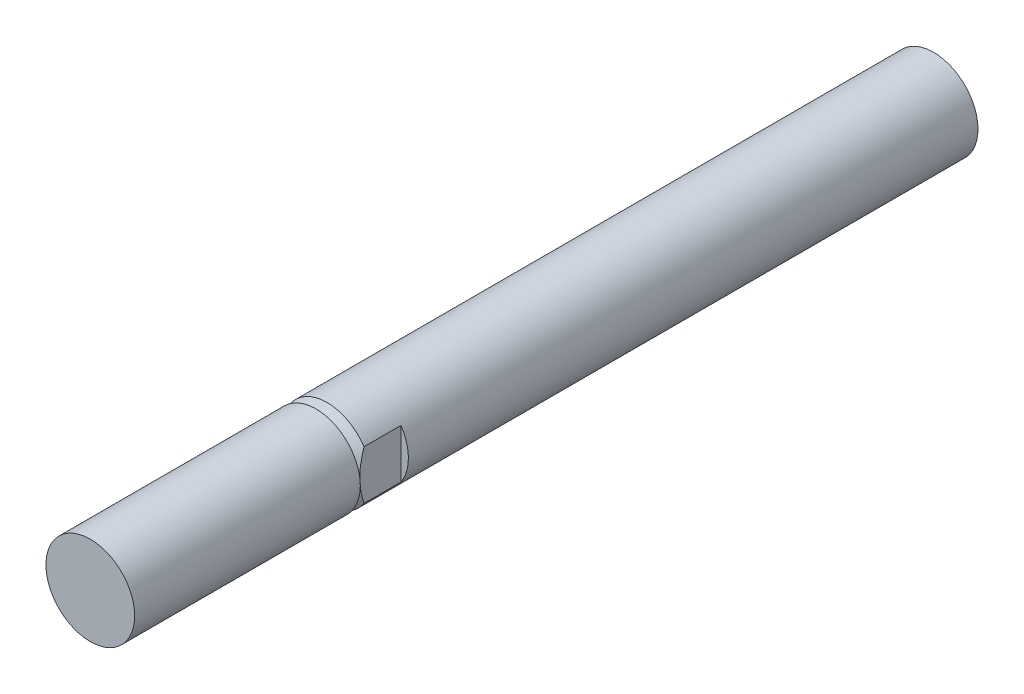
ISO-10303-21;
HEADER;
FILE_DESCRIPTION(('STEP AP214'),'2;1');
FILE_NAME('part.step','',(''),(''),'','','');
FILE_SCHEMA(('AUTOMOTIVE_DESIGN { 1 0 10303 214 1 1 1 1 }'));
ENDSEC;
DATA;
#1=APPLICATION_CONTEXT('core data for automotive mechanical design processes');
#2=APPLICATION_PROTOCOL_DEFINITION('international standard','automotive_design',2000,#1);
#3=PRODUCT_CONTEXT('',#1,'mechanical');
#4=PRODUCT('Part','Part','',(#3));
#5=PRODUCT_RELATED_PRODUCT_CATEGORY('part','',(#4));
#6=PRODUCT_DEFINITION_FORMATION('','',#4);
#7=PRODUCT_DEFINITION_CONTEXT('part definition',#1,'design');
#8=PRODUCT_DEFINITION('design','',#6,#7);
#9=PRODUCT_DEFINITION_SHAPE('','',#8);
#10=(LENGTH_UNIT() NAMED_UNIT(*) SI_UNIT(.MILLI.,.METRE.));
#11=(NAMED_UNIT(*) PLANE_ANGLE_UNIT() SI_UNIT($,.RADIAN.));
#12=(NAMED_UNIT(*) SI_UNIT($,.STERADIAN.) SOLID_ANGLE_UNIT());
#13=UNCERTAINTY_MEASURE_WITH_UNIT(LENGTH_MEASURE(1.E-05),#10,'distance_accuracy_value','');
#14=(GEOMETRIC_REPRESENTATION_CONTEXT(3) GLOBAL_UNCERTAINTY_ASSIGNED_CONTEXT((#13)) GLOBAL_UNIT_ASSIGNED_CONTEXT((#10,
#11,#12)) REPRESENTATION_CONTEXT('',''));
#15=CARTESIAN_POINT('',(0.,0.,0.));
#16=DIRECTION('',(0.,0.,1.));
#17=DIRECTION('',(1.,0.,0.));
#18=AXIS2_PLACEMENT_3D('',#15,#16,#17);
#19=CARTESIAN_POINT('',(0.,0.,-65.4852813742386));
#20=DIRECTION('',(0.,0.,1.));
#21=DIRECTION('',(1.,0.,0.));
#22=AXIS2_PLACEMENT_3D('',#19,#20,#21);
#23=CYLINDRICAL_SURFACE('',#22,3.);
#24=CARTESIAN_POINT('',(0.,0.,0.));
#25=DIRECTION('',(0.,0.,1.));
#26=DIRECTION('',(1.,0.,0.));
#27=AXIS2_PLACEMENT_3D('',#24,#25,#26);
#28=CIRCLE('',#27,3.);
#29=CARTESIAN_POINT('',(3.,0.,0.));
#30=VERTEX_POINT('',#29);
#31=EDGE_CURVE('E95',#30,#30,#28,.T.);
#32=ORIENTED_EDGE('',*,*,#31,.F.);
#33=EDGE_LOOP('',(#32));
#34=FACE_BOUND('',#33,.T.);
#35=CARTESIAN_POINT('',(0.,0.,-15.25));
#36=DIRECTION('',(0.,0.,1.));
#37=DIRECTION('',(1.,0.,0.));
#38=AXIS2_PLACEMENT_3D('',#35,#36,#37);
#39=CIRCLE('',#38,3.);
#40=CARTESIAN_POINT('',(3.,0.,-15.25));
#41=VERTEX_POINT('',#40);
#42=EDGE_CURVE('E98',#41,#41,#39,.T.);
#43=ORIENTED_EDGE('',*,*,#42,.T.);
#44=EDGE_LOOP('',(#43));
#45=FACE_BOUND('',#44,.T.);
#46=ADVANCED_FACE('F32',(#34,#45),#23,.T.);
#47=CARTESIAN_POINT('',(0.,0.,0.));
#48=DIRECTION('',(0.,0.,1.));
#49=DIRECTION('',(1.,0.,0.));
#50=AXIS2_PLACEMENT_3D('',#47,#48,#49);
#51=PLANE('',#50);
#52=ORIENTED_EDGE('',*,*,#31,.T.);
#53=EDGE_LOOP('',(#52));
#54=FACE_BOUND('',#53,.T.);
#55=ADVANCED_FACE('F143',(#54),#51,.T.);
#56=CARTESIAN_POINT('',(0.,0.,-15.25));
#57=DIRECTION('',(0.,0.,1.));
#58=DIRECTION('',(1.,0.,0.));
#59=AXIS2_PLACEMENT_3D('',#56,#57,#58);
#60=CONICAL_SURFACE('',#59,3.,1.0471975511966);
#61=CARTESIAN_POINT('',(0.,0.,-15.625));
#62=DIRECTION('',(0.,0.,1.));
#63=DIRECTION('',(1.,0.,0.));
#64=AXIS2_PLACEMENT_3D('',#61,#62,#63);
#65=CIRCLE('',#64,2.35048094716167);
#66=CARTESIAN_POINT('',(2.35048094716167,0.,-15.625));
#67=VERTEX_POINT('',#66);
#68=EDGE_CURVE('E104',#67,#67,#65,.T.);
#69=ORIENTED_EDGE('',*,*,#68,.T.);
#70=EDGE_LOOP('',(#69));
#71=FACE_BOUND('',#70,.T.);
#72=ORIENTED_EDGE('',*,*,#42,.F.);
#73=EDGE_LOOP('',(#72));
#74=FACE_BOUND('',#73,.T.);
#75=ADVANCED_FACE('F126',(#71,#74),#60,.T.);
#76=CARTESIAN_POINT('',(0.,0.,-15.625));
#77=DIRECTION('',(0.,0.,-1.));
#78=DIRECTION('',(-1.,0.,0.));
#79=AXIS2_PLACEMENT_3D('',#76,#77,#78);
#80=CONICAL_SURFACE('',#79,2.35048094716167,1.0471975511966);
#81=CARTESIAN_POINT('',(-2.5,-4.81793860033048,-17.4017717973103));
#82=CARTESIAN_POINT('',(-2.5,-4.69838379168555,-17.3405141325334));
#83=CARTESIAN_POINT('',(-2.5,-4.57863903285995,-17.2796233257586));
#84=CARTESIAN_POINT('',(-2.5,-4.33867077736017,-17.1587721081766));
#85=CARTESIAN_POINT('',(-2.5,-4.21844724785575,-17.0988117626031));
#86=CARTESIAN_POINT('',(-2.5,-3.97713061718876,-16.9798746260798));
#87=CARTESIAN_POINT('',(-2.5,-3.85603607746253,-16.9209007478018));
#88=CARTESIAN_POINT('',(-2.5,-3.61316609263024,-16.8043772100494));
#89=CARTESIAN_POINT('',(-2.5,-3.49139066457805,-16.7468275150983));
#90=CARTESIAN_POINT('',(-2.5,-3.2404121498268,-16.6304602379033));
#91=CARTESIAN_POINT('',(-2.5,-3.1111629059294,-16.5717418656522));
#92=CARTESIAN_POINT('',(-2.5,-2.85152693652563,-16.456879159109));
#93=CARTESIAN_POINT('',(-2.5,-2.72114025834698,-16.4007347183201));
#94=CARTESIAN_POINT('',(-2.5,-2.45907235317036,-16.2918692011967));
#95=CARTESIAN_POINT('',(-2.5,-2.32739237853672,-16.2391451292102));
#96=CARTESIAN_POINT('',(-2.5,-2.06233467793914,-16.1381810991474));
#97=CARTESIAN_POINT('',(-2.5,-1.92895725263663,-16.0899403591894));
#98=CARTESIAN_POINT('',(-2.5,-1.66159629743113,-15.9999263914234));
#99=CARTESIAN_POINT('',(-2.5,-1.5276344347262,-15.9580896234961));
#100=CARTESIAN_POINT('',(-2.5,-1.25748328973638,-15.8821937639213));
#101=CARTESIAN_POINT('',(-2.5,-1.12129403064475,-15.8481345913429));
#102=CARTESIAN_POINT('',(-2.5,-0.849309674673648,-15.7906265740925));
#103=CARTESIAN_POINT('',(-2.5,-0.713554976247273,-15.7669909381224));
#104=CARTESIAN_POINT('',(-2.5,-0.440472397486285,-15.7315514878634));
#105=CARTESIAN_POINT('',(-2.5,-0.30314488357933,-15.7197449721949));
#106=CARTESIAN_POINT('',(-2.5,-0.0841222520504025,-15.711373879411));
#107=CARTESIAN_POINT('',(-2.5,-0.00257239136520686,-15.7105576243309));
#108=CARTESIAN_POINT('',(-2.5,0.160450666129283,-15.7135308252926));
#109=CARTESIAN_POINT('',(-2.5,0.241923859889431,-15.7173204573621));
#110=CARTESIAN_POINT('',(-2.5,0.404551415813537,-15.7293584801001));
#111=CARTESIAN_POINT('',(-2.5,0.485705709759785,-15.7376077774814));
#112=CARTESIAN_POINT('',(-2.5,0.647486827845084,-15.7582526187821));
#113=CARTESIAN_POINT('',(-2.5,0.728113603611079,-15.7706485376578));
#114=CARTESIAN_POINT('',(-2.5,0.890812172595438,-15.7995491324688));
#115=CARTESIAN_POINT('',(-2.5,0.97286610918155,-15.8161534080264));
#116=CARTESIAN_POINT('',(-2.5,1.13619666010214,-15.8528023635103));
#117=CARTESIAN_POINT('',(-2.5,1.21747325822192,-15.8728471150377));
#118=CARTESIAN_POINT('',(-2.5,1.37925919436247,-15.9158971739533));
#119=CARTESIAN_POINT('',(-2.5,1.45976829527697,-15.9389033663069));
#120=CARTESIAN_POINT('',(-2.5,1.620015699497,-15.9874261343163));
#121=CARTESIAN_POINT('',(-2.5,1.69975404831211,-16.0129425607468));
#122=CARTESIAN_POINT('',(-2.5,1.93372402907988,-16.0912588997182));
#123=CARTESIAN_POINT('',(-2.5,2.08696868176532,-16.1470068492297));
#124=CARTESIAN_POINT('',(-2.5,2.39126756520607,-16.2642237748622));
#125=CARTESIAN_POINT('',(-2.5,2.54232112508943,-16.3256944621578));
#126=CARTESIAN_POINT('',(-2.5,2.84281888331128,-16.452834117824));
#127=CARTESIAN_POINT('',(-2.5,2.99226132411979,-16.5185072168529));
#128=CARTESIAN_POINT('',(-2.5,3.28974519522344,-16.6528920724727));
#129=CARTESIAN_POINT('',(-2.5,3.4377867811834,-16.7216034865118));
#130=CARTESIAN_POINT('',(-2.5,3.73330639647042,-16.8615574332983));
#131=CARTESIAN_POINT('',(-2.5,3.88078058075447,-16.9328080586117));
#132=CARTESIAN_POINT('',(-2.5,4.1748654950973,-17.0770722316009));
#133=CARTESIAN_POINT('',(-2.5,4.32147620702218,-17.1500858161378));
#134=CARTESIAN_POINT('',(-2.5,4.76011529781237,-17.3710736157298));
#135=CARTESIAN_POINT('',(-2.5,5.05112053313033,-17.5210765649037));
#136=CARTESIAN_POINT('',(-2.5,5.5923599264763,-17.8041112421102));
#137=CARTESIAN_POINT('',(-2.5,5.84281913396191,-17.9367155602142));
#138=CARTESIAN_POINT('',(-2.5,6.34280158348747,-18.2037724972034));
#139=CARTESIAN_POINT('',(-2.5,6.59232466873618,-18.3382254095326));
#140=CARTESIAN_POINT('',(-2.5,7.08889747255229,-18.6075052987425));
#141=CARTESIAN_POINT('',(-2.5,7.3359522396257,-18.7423229845447));
#142=CARTESIAN_POINT('',(-2.5,7.82946604805437,-19.0129374854761));
#143=CARTESIAN_POINT('',(-2.5,8.07592519070801,-19.1487341157809));
#144=CARTESIAN_POINT('',(-2.5,8.32218900881266,-19.2848815186773));
#145=B_SPLINE_CURVE_WITH_KNOTS('',3,(#81,#82,#83,#84,#85,#86,#87,#88,#89,#90,#91,#92,#93,#94,
#95,#96,#97,#98,#99,#100,#101,#102,#103,#104,#105,#106,#107,#108,#109,#110,#111,#112,#113,#114,
#115,#116,#117,#118,#119,#120,#121,#122,#123,#124,#125,#126,#127,#128,#129,#130,#131,#132,#133,
#134,#135,#136,#137,#138,#139,#140,#141,#142,#143,#144),.UNSPECIFIED.,.F.,.F.,(4,2,2,2,2,2,2,2,
2,2,2,2,2,2,2,2,2,2,2,2,2,2,2,2,2,2,2,2,2,2,2,4),(0.,0.40300656306994,0.806041254020603,
1.21010828081371,1.61416523208556,2.04002990268203,2.46587693711974,2.8913458223634,
3.31674036711918,3.73759408086623,4.1584434151648,4.57140986932208,4.98428199409834,
5.22882539854366,5.47337814922667,5.7179806396394,5.96260525410868,6.21367152510888,
6.46474302179146,6.71588972095366,6.96702149927908,7.45604740402945,7.94522000655761,
8.43488104325745,8.92448701367628,9.41582462568016,9.90717251978972,10.8893028547359,
11.7394860044739,12.5898057063759,13.4341414222954,14.2783216982539),.UNSPECIFIED.);
#146=CARTESIAN_POINT('',(-2.5,-1.6583123951777,-16.));
#147=VERTEX_POINT('',#146);
#148=CARTESIAN_POINT('',(-2.5,1.6583123951777,-16.));
#149=VERTEX_POINT('',#148);
#150=EDGE_CURVE('E71',#147,#149,#145,.T.);
#151=ORIENTED_EDGE('',*,*,#150,.F.);
#152=CARTESIAN_POINT('',(0.,0.,-16.));
#153=DIRECTION('',(0.,0.,1.));
#154=DIRECTION('',(1.,0.,0.));
#155=AXIS2_PLACEMENT_3D('',#152,#153,#154);
#156=CIRCLE('',#155,3.);
#157=CARTESIAN_POINT('',(2.5,-1.6583123951777,-16.));
#158=VERTEX_POINT('',#157);
#159=EDGE_CURVE('E103',#147,#158,#156,.T.);
#160=ORIENTED_EDGE('',*,*,#159,.T.);
#161=CARTESIAN_POINT('',(2.5,-4.81793860033048,-17.4017717973103));
#162=CARTESIAN_POINT('',(2.5,-4.69838379168555,-17.3405141325334));
#163=CARTESIAN_POINT('',(2.5,-4.57863903285995,-17.2796233257586));
#164=CARTESIAN_POINT('',(2.5,-4.33867077736017,-17.1587721081766));
#165=CARTESIAN_POINT('',(2.5,-4.21844724785575,-17.0988117626031));
#166=CARTESIAN_POINT('',(2.5,-3.97713061718876,-16.9798746260798));
#167=CARTESIAN_POINT('',(2.5,-3.85603607746253,-16.9209007478018));
#168=CARTESIAN_POINT('',(2.5,-3.61316609263024,-16.8043772100494));
#169=CARTESIAN_POINT('',(2.5,-3.49139066457805,-16.7468275150983));
#170=CARTESIAN_POINT('',(2.5,-3.2404121498268,-16.6304602379033));
#171=CARTESIAN_POINT('',(2.5,-3.1111629059294,-16.5717418656522));
#172=CARTESIAN_POINT('',(2.5,-2.85152693652563,-16.456879159109));
#173=CARTESIAN_POINT('',(2.5,-2.72114025834698,-16.4007347183201));
#174=CARTESIAN_POINT('',(2.5,-2.45907235317036,-16.2918692011967));
#175=CARTESIAN_POINT('',(2.5,-2.32739237853672,-16.2391451292102));
#176=CARTESIAN_POINT('',(2.5,-2.06233467793914,-16.1381810991474));
#177=CARTESIAN_POINT('',(2.5,-1.92895725263663,-16.0899403591894));
#178=CARTESIAN_POINT('',(2.5,-1.66159629743113,-15.9999263914234));
#179=CARTESIAN_POINT('',(2.5,-1.5276344347262,-15.9580896234961));
#180=CARTESIAN_POINT('',(2.5,-1.25748328973638,-15.8821937639213));
#181=CARTESIAN_POINT('',(2.5,-1.12129403064475,-15.8481345913429));
#182=CARTESIAN_POINT('',(2.5,-0.849309674673648,-15.7906265740925));
#183=CARTESIAN_POINT('',(2.5,-0.713554976247273,-15.7669909381224));
#184=CARTESIAN_POINT('',(2.5,-0.440472397486285,-15.7315514878634));
#185=CARTESIAN_POINT('',(2.5,-0.30314488357933,-15.7197449721949));
#186=CARTESIAN_POINT('',(2.5,-0.0841222520504025,-15.711373879411));
#187=CARTESIAN_POINT('',(2.5,-0.00257239136520686,-15.7105576243309));
#188=CARTESIAN_POINT('',(2.5,0.160450666129283,-15.7135308252926));
#189=CARTESIAN_POINT('',(2.5,0.241923859889431,-15.7173204573621));
#190=CARTESIAN_POINT('',(2.5,0.404551415813537,-15.7293584801001));
#191=CARTESIAN_POINT('',(2.5,0.485705709759785,-15.7376077774814));
#192=CARTESIAN_POINT('',(2.5,0.647486827845084,-15.7582526187821));
#193=CARTESIAN_POINT('',(2.5,0.728113603611079,-15.7706485376578));
#194=CARTESIAN_POINT('',(2.5,0.890812172595438,-15.7995491324688));
#195=CARTESIAN_POINT('',(2.5,0.97286610918155,-15.8161534080264));
#196=CARTESIAN_POINT('',(2.5,1.13619666010214,-15.8528023635103));
#197=CARTESIAN_POINT('',(2.5,1.21747325822192,-15.8728471150377));
#198=CARTESIAN_POINT('',(2.5,1.37925919436247,-15.9158971739533));
#199=CARTESIAN_POINT('',(2.5,1.45976829527697,-15.9389033663069));
#200=CARTESIAN_POINT('',(2.5,1.620015699497,-15.9874261343163));
#201=CARTESIAN_POINT('',(2.5,1.69975404831211,-16.0129425607468));
#202=CARTESIAN_POINT('',(2.5,1.93372402907988,-16.0912588997182));
#203=CARTESIAN_POINT('',(2.5,2.08696868176532,-16.1470068492297));
#204=CARTESIAN_POINT('',(2.5,2.39126756520607,-16.2642237748622));
#205=CARTESIAN_POINT('',(2.5,2.54232112508943,-16.3256944621578));
#206=CARTESIAN_POINT('',(2.5,2.84281888331128,-16.452834117824));
#207=CARTESIAN_POINT('',(2.5,2.99226132411979,-16.5185072168529));
#208=CARTESIAN_POINT('',(2.5,3.28974519522344,-16.6528920724727));
#209=CARTESIAN_POINT('',(2.5,3.4377867811834,-16.7216034865118));
#210=CARTESIAN_POINT('',(2.5,3.73330639647042,-16.8615574332983));
#211=CARTESIAN_POINT('',(2.5,3.88078058075447,-16.9328080586117));
#212=CARTESIAN_POINT('',(2.5,4.1748654950973,-17.0770722316009));
#213=CARTESIAN_POINT('',(2.5,4.32147620702218,-17.1500858161378));
#214=CARTESIAN_POINT('',(2.5,4.76011529781237,-17.3710736157298));
#215=CARTESIAN_POINT('',(2.5,5.05112053313033,-17.5210765649037));
#216=CARTESIAN_POINT('',(2.5,5.5923599264763,-17.8041112421102));
#217=CARTESIAN_POINT('',(2.5,5.84281913396191,-17.9367155602142));
#218=CARTESIAN_POINT('',(2.5,6.34280158348747,-18.2037724972034));
#219=CARTESIAN_POINT('',(2.5,6.59232466873618,-18.3382254095326));
#220=CARTESIAN_POINT('',(2.5,7.08889747255229,-18.6075052987425));
#221=CARTESIAN_POINT('',(2.5,7.3359522396257,-18.7423229845447));
#222=CARTESIAN_POINT('',(2.5,7.82946604805437,-19.0129374854761));
#223=CARTESIAN_POINT('',(2.5,8.07592519070801,-19.1487341157809));
#224=CARTESIAN_POINT('',(2.5,8.32218900881266,-19.2848815186773));
#225=B_SPLINE_CURVE_WITH_KNOTS('',3,(#161,#162,#163,#164,#165,#166,#167,#168,#169,#170,#171,
#172,#173,#174,#175,#176,#177,#178,#179,#180,#181,#182,#183,#184,#185,#186,#187,#188,#189,#190,
#191,#192,#193,#194,#195,#196,#197,#198,#199,#200,#201,#202,#203,#204,#205,#206,#207,#208,#209,
#210,#211,#212,#213,#214,#215,#216,#217,#218,#219,#220,#221,#222,#223,#224),.UNSPECIFIED.,.F.,
.F.,(4,2,2,2,2,2,2,2,2,2,2,2,2,2,2,2,2,2,2,2,2,2,2,2,2,2,2,2,2,2,2,4),(0.,0.40300656306994,
0.806041254020603,1.21010828081371,1.61416523208556,2.04002990268203,2.46587693711974,
2.8913458223634,3.31674036711918,3.73759408086623,4.1584434151648,4.57140986932208,
4.98428199409834,5.22882539854366,5.47337814922667,5.7179806396394,5.96260525410868,
6.21367152510888,6.46474302179146,6.71588972095366,6.96702149927908,7.45604740402945,
7.94522000655761,8.43488104325745,8.92448701367628,9.41582462568016,9.90717251978972,
10.8893028547359,11.7394860044739,12.5898057063759,13.4341414222954,14.2783216982539),.UNSPECIFIED.);
#226=CARTESIAN_POINT('',(2.5,1.6583123951777,-16.));
#227=VERTEX_POINT('',#226);
#228=EDGE_CURVE('E107',#227,#158,#225,.F.);
#229=ORIENTED_EDGE('',*,*,#228,.F.);
#230=EDGE_CURVE('E101',#227,#149,#156,.T.);
#231=ORIENTED_EDGE('',*,*,#230,.T.);
#232=EDGE_LOOP('',(#151,#160,#229,#231));
#233=FACE_BOUND('',#232,.T.);
#234=ORIENTED_EDGE('',*,*,#68,.F.);
#235=EDGE_LOOP('',(#234));
#236=FACE_BOUND('',#235,.T.);
#237=ADVANCED_FACE('F121',(#233,#236),#80,.T.);
#238=CARTESIAN_POINT('',(0.,0.,-57.));
#239=DIRECTION('',(0.,0.,1.));
#240=DIRECTION('',(1.,0.,0.));
#241=AXIS2_PLACEMENT_3D('',#238,#239,#240);
#242=PLANE('',#241);
#243=CARTESIAN_POINT('',(0.,0.,-57.));
#244=DIRECTION('',(0.,0.,1.));
#245=DIRECTION('',(1.,0.,0.));
#246=AXIS2_PLACEMENT_3D('',#243,#244,#245);
#247=CIRCLE('',#246,3.);
#248=CARTESIAN_POINT('',(3.,0.,-57.));
#249=VERTEX_POINT('',#248);
#250=EDGE_CURVE('E92',#249,#249,#247,.F.);
#251=ORIENTED_EDGE('',*,*,#250,.T.);
#252=EDGE_LOOP('',(#251));
#253=FACE_BOUND('',#252,.T.);
#254=ADVANCED_FACE('F125',(#253),#242,.F.);
#255=DIRECTION('',(0.,0.,1.));
#256=VECTOR('',#255,1.);
#257=CARTESIAN_POINT('',(-2.5,1.6583123951777,-65.4852813742386));
#258=LINE('',#257,#256);
#259=CARTESIAN_POINT('',(-2.5,1.6583123951777,-18.5));
#260=VERTEX_POINT('',#259);
#261=EDGE_CURVE('E11',#149,#260,#258,.F.);
#262=ORIENTED_EDGE('',*,*,#261,.F.);
#263=ORIENTED_EDGE('',*,*,#230,.F.);
#264=DIRECTION('',(0.,0.,1.));
#265=VECTOR('',#264,1.);
#266=CARTESIAN_POINT('',(2.5,1.6583123951777,-65.4852813742386));
#267=LINE('',#266,#265);
#268=CARTESIAN_POINT('',(2.5,1.6583123951777,-18.5));
#269=VERTEX_POINT('',#268);
#270=EDGE_CURVE('E88',#269,#227,#267,.T.);
#271=ORIENTED_EDGE('',*,*,#270,.F.);
#272=CARTESIAN_POINT('',(0.,0.,-18.5));
#273=DIRECTION('',(0.,0.,-1.));
#274=DIRECTION('',(-1.,0.,0.));
#275=AXIS2_PLACEMENT_3D('',#272,#273,#274);
#276=CIRCLE('',#275,3.);
#277=CARTESIAN_POINT('',(2.5,-1.6583123951777,-18.5));
#278=VERTEX_POINT('',#277);
#279=EDGE_CURVE('E90',#278,#269,#276,.F.);
#280=ORIENTED_EDGE('',*,*,#279,.F.);
#281=DIRECTION('',(0.,0.,1.));
#282=VECTOR('',#281,1.);
#283=CARTESIAN_POINT('',(2.5,-1.6583123951777,-65.4852813742386));
#284=LINE('',#283,#282);
#285=EDGE_CURVE('E84',#158,#278,#284,.F.);
#286=ORIENTED_EDGE('',*,*,#285,.F.);
#287=ORIENTED_EDGE('',*,*,#159,.F.);
#288=DIRECTION('',(0.,0.,1.));
#289=VECTOR('',#288,1.);
#290=CARTESIAN_POINT('',(-2.5,-1.6583123951777,-65.4852813742386));
#291=LINE('',#290,#289);
#292=CARTESIAN_POINT('',(-2.5,-1.6583123951777,-18.5));
#293=VERTEX_POINT('',#292);
#294=EDGE_CURVE('E83',#293,#147,#291,.T.);
#295=ORIENTED_EDGE('',*,*,#294,.F.);
#296=CARTESIAN_POINT('',(0.,0.,-18.5));
#297=DIRECTION('',(0.,0.,-1.));
#298=DIRECTION('',(-1.,0.,0.));
#299=AXIS2_PLACEMENT_3D('',#296,#297,#298);
#300=CIRCLE('',#299,3.);
#301=EDGE_CURVE('E39',#260,#293,#300,.F.);
#302=ORIENTED_EDGE('',*,*,#301,.F.);
#303=EDGE_LOOP('',(#262,#263,#271,#280,#286,#287,#295,#302));
#304=FACE_BOUND('',#303,.T.);
#305=ORIENTED_EDGE('',*,*,#250,.F.);
#306=EDGE_LOOP('',(#305));
#307=FACE_BOUND('',#306,.T.);
#308=ADVANCED_FACE('F80',(#304,#307),#23,.T.);
#309=CARTESIAN_POINT('',(2.5,-3.,-18.5));
#310=DIRECTION('',(-1.,0.,0.));
#311=DIRECTION('',(0.,0.,1.));
#312=AXIS2_PLACEMENT_3D('',#309,#310,#311);
#313=PLANE('',#312);
#314=ORIENTED_EDGE('',*,*,#285,.T.);
#315=DIRECTION('',(0.,1.,0.));
#316=VECTOR('',#315,1.);
#317=CARTESIAN_POINT('',(2.5,-3.,-18.5));
#318=LINE('',#317,#316);
#319=EDGE_CURVE('E52',#278,#269,#318,.T.);
#320=ORIENTED_EDGE('',*,*,#319,.T.);
#321=ORIENTED_EDGE('',*,*,#270,.T.);
#322=ORIENTED_EDGE('',*,*,#228,.T.);
#323=EDGE_LOOP('',(#314,#320,#321,#322));
#324=FACE_BOUND('',#323,.T.);
#325=ADVANCED_FACE('F117',(#324),#313,.F.);
#326=CARTESIAN_POINT('',(5.375,-3.,-18.5));
#327=DIRECTION('',(0.,0.,-1.));
#328=DIRECTION('',(-1.,0.,0.));
#329=AXIS2_PLACEMENT_3D('',#326,#327,#328);
#330=PLANE('',#329);
#331=ORIENTED_EDGE('',*,*,#279,.T.);
#332=ORIENTED_EDGE('',*,*,#319,.F.);
#333=EDGE_LOOP('',(#331,#332));
#334=FACE_BOUND('',#333,.T.);
#335=ADVANCED_FACE('F128',(#334),#330,.F.);
#336=CARTESIAN_POINT('',(-2.5,-3.,-18.5));
#337=DIRECTION('',(0.,0.,-1.));
#338=DIRECTION('',(-1.,0.,0.));
#339=AXIS2_PLACEMENT_3D('',#336,#337,#338);
#340=PLANE('',#339);
#341=ORIENTED_EDGE('',*,*,#301,.T.);
#342=DIRECTION('',(0.,1.,0.));
#343=VECTOR('',#342,1.);
#344=CARTESIAN_POINT('',(-2.5,-3.,-18.5));
#345=LINE('',#344,#343);
#346=EDGE_CURVE('E45',#293,#260,#345,.T.);
#347=ORIENTED_EDGE('',*,*,#346,.T.);
#348=EDGE_LOOP('',(#341,#347));
#349=FACE_BOUND('',#348,.T.);
#350=ADVANCED_FACE('F77',(#349),#340,.F.);
#351=CARTESIAN_POINT('',(-2.5,-3.,-15.625));
#352=DIRECTION('',(1.,0.,0.));
#353=DIRECTION('',(0.,0.,-1.));
#354=AXIS2_PLACEMENT_3D('',#351,#352,#353);
#355=PLANE('',#354);
#356=ORIENTED_EDGE('',*,*,#261,.T.);
#357=ORIENTED_EDGE('',*,*,#346,.F.);
#358=ORIENTED_EDGE('',*,*,#294,.T.);
#359=ORIENTED_EDGE('',*,*,#150,.T.);
#360=EDGE_LOOP('',(#356,#357,#358,#359));
#361=FACE_BOUND('',#360,.T.);
#362=ADVANCED_FACE('F69',(#361),#355,.F.);
#363=CLOSED_SHELL('',(#46,#55,#75,#237,#254,#308,#325,#335,#350,#362));
#364=MANIFOLD_SOLID_BREP('B2',#363);
#365=ADVANCED_BREP_SHAPE_REPRESENTATION('',(#18,#364),#14);
#366=SHAPE_DEFINITION_REPRESENTATION(#9,#365);
ENDSEC;
END-ISO-10303-21;
